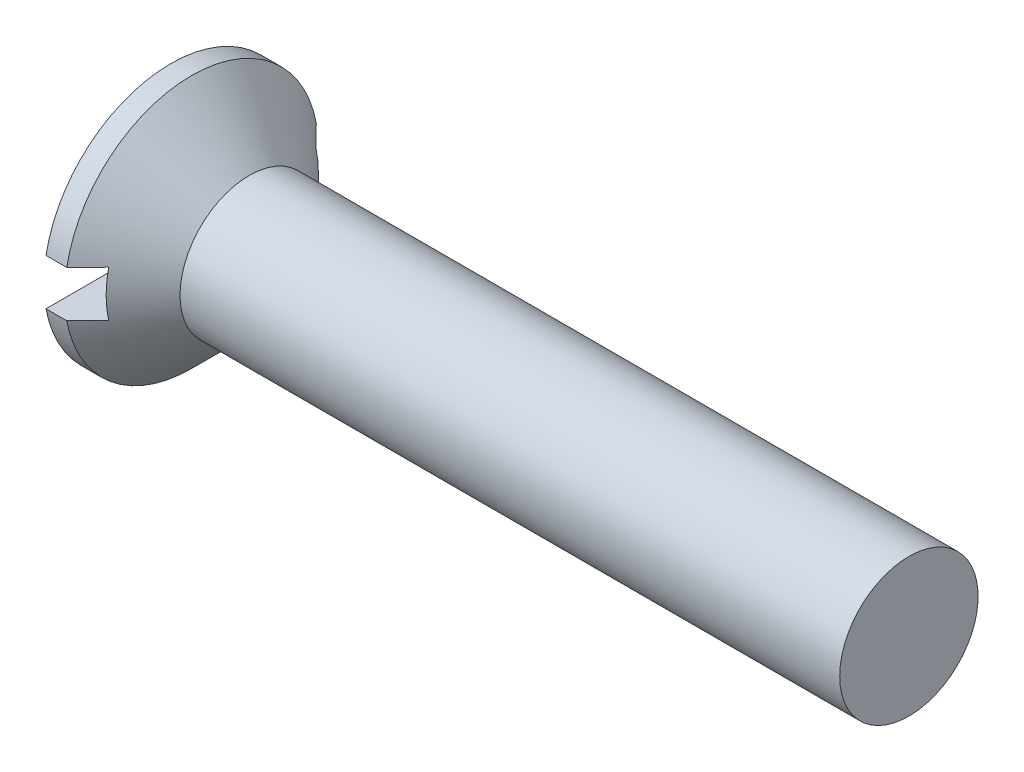
ISO-10303-21;
HEADER;
FILE_DESCRIPTION(('STEP AP214'),'2;1');
FILE_NAME('part.step','',(''),(''),'','','');
FILE_SCHEMA(('AUTOMOTIVE_DESIGN { 1 0 10303 214 1 1 1 1 }'));
ENDSEC;
DATA;
#1=APPLICATION_CONTEXT('core data for automotive mechanical design processes');
#2=APPLICATION_PROTOCOL_DEFINITION('international standard','automotive_design',2000,#1);
#3=PRODUCT_CONTEXT('',#1,'mechanical');
#4=PRODUCT('Part','Part','',(#3));
#5=PRODUCT_RELATED_PRODUCT_CATEGORY('part','',(#4));
#6=PRODUCT_DEFINITION_FORMATION('','',#4);
#7=PRODUCT_DEFINITION_CONTEXT('part definition',#1,'design');
#8=PRODUCT_DEFINITION('design','',#6,#7);
#9=PRODUCT_DEFINITION_SHAPE('','',#8);
#10=(LENGTH_UNIT() NAMED_UNIT(*) SI_UNIT(.MILLI.,.METRE.));
#11=(NAMED_UNIT(*) PLANE_ANGLE_UNIT() SI_UNIT($,.RADIAN.));
#12=(NAMED_UNIT(*) SI_UNIT($,.STERADIAN.) SOLID_ANGLE_UNIT());
#13=UNCERTAINTY_MEASURE_WITH_UNIT(LENGTH_MEASURE(1.E-05),#10,'distance_accuracy_value','');
#14=(GEOMETRIC_REPRESENTATION_CONTEXT(3) GLOBAL_UNCERTAINTY_ASSIGNED_CONTEXT((#13)) GLOBAL_UNIT_ASSIGNED_CONTEXT((#10,
#11,#12)) REPRESENTATION_CONTEXT('',''));
#15=CARTESIAN_POINT('',(0.,0.,0.));
#16=DIRECTION('',(0.,0.,1.));
#17=DIRECTION('',(1.,0.,0.));
#18=AXIS2_PLACEMENT_3D('',#15,#16,#17);
#19=CARTESIAN_POINT('',(0.,0.,0.));
#20=DIRECTION('',(-1.,0.,0.));
#21=DIRECTION('',(0.,0.,1.));
#22=AXIS2_PLACEMENT_3D('',#19,#20,#21);
#23=PLANE('',#22);
#24=DIRECTION('',(0.,0.,-1.));
#25=VECTOR('',#24,1.);
#26=CARTESIAN_POINT('',(0.,0.5,2.75));
#27=LINE('',#26,#25);
#28=CARTESIAN_POINT('',(0.,0.5,2.70416345659799));
#29=VERTEX_POINT('',#28);
#30=CARTESIAN_POINT('',(0.,0.5,-2.70416345659799));
#31=VERTEX_POINT('',#30);
#32=EDGE_CURVE('E162',#29,#31,#27,.T.);
#33=ORIENTED_EDGE('',*,*,#32,.F.);
#34=CARTESIAN_POINT('',(0.,0.,0.));
#35=DIRECTION('',(-1.,0.,0.));
#36=DIRECTION('',(0.,0.,1.));
#37=AXIS2_PLACEMENT_3D('',#34,#35,#36);
#38=CIRCLE('',#37,2.75);
#39=EDGE_CURVE('E113',#29,#31,#38,.T.);
#40=ORIENTED_EDGE('',*,*,#39,.T.);
#41=EDGE_LOOP('',(#33,#40));
#42=FACE_BOUND('',#41,.T.);
#43=ADVANCED_FACE('F32',(#42),#23,.T.);
#44=CARTESIAN_POINT('',(-6.34999999999999,0.,0.));
#45=DIRECTION('',(-1.,0.,0.));
#46=DIRECTION('',(0.,0.,1.));
#47=AXIS2_PLACEMENT_3D('',#44,#45,#46);
#48=CYLINDRICAL_SURFACE('',#47,2.75);
#49=DIRECTION('',(-1.,0.,0.));
#50=VECTOR('',#49,1.);
#51=CARTESIAN_POINT('',(-6.34999999999999,0.5,-2.70416345659799));
#52=LINE('',#51,#50);
#53=CARTESIAN_POINT('',(0.450000000000005,0.5,-2.70416345659799));
#54=VERTEX_POINT('',#53);
#55=EDGE_CURVE('E60',#31,#54,#52,.F.);
#56=ORIENTED_EDGE('',*,*,#55,.F.);
#57=ORIENTED_EDGE('',*,*,#39,.F.);
#58=DIRECTION('',(-1.,0.,0.));
#59=VECTOR('',#58,1.);
#60=CARTESIAN_POINT('',(-6.34999999999999,0.5,2.70416345659799));
#61=LINE('',#60,#59);
#62=CARTESIAN_POINT('',(0.450000000000005,0.5,2.70416345659799));
#63=VERTEX_POINT('',#62);
#64=EDGE_CURVE('E168',#63,#29,#61,.T.);
#65=ORIENTED_EDGE('',*,*,#64,.F.);
#66=CARTESIAN_POINT('',(0.450000000000005,0.,0.));
#67=DIRECTION('',(-1.,0.,0.));
#68=DIRECTION('',(0.,0.,1.));
#69=AXIS2_PLACEMENT_3D('',#66,#67,#68);
#70=CIRCLE('',#69,2.75);
#71=EDGE_CURVE('E107',#63,#54,#70,.T.);
#72=ORIENTED_EDGE('',*,*,#71,.T.);
#73=EDGE_LOOP('',(#56,#57,#65,#72));
#74=FACE_BOUND('',#73,.T.);
#75=ADVANCED_FACE('F147',(#74),#48,.T.);
#76=DIRECTION('',(0.,0.,1.));
#77=VECTOR('',#76,1.);
#78=CARTESIAN_POINT('',(0.,-0.5,-2.75));
#79=LINE('',#78,#77);
#80=CARTESIAN_POINT('',(0.,-0.5,-2.70416345659799));
#81=VERTEX_POINT('',#80);
#82=CARTESIAN_POINT('',(0.,-0.5,2.70416345659799));
#83=VERTEX_POINT('',#82);
#84=EDGE_CURVE('E101',#81,#83,#79,.T.);
#85=ORIENTED_EDGE('',*,*,#84,.F.);
#86=EDGE_CURVE('E109',#81,#83,#38,.T.);
#87=ORIENTED_EDGE('',*,*,#86,.T.);
#88=EDGE_LOOP('',(#85,#87));
#89=FACE_BOUND('',#88,.T.);
#90=ADVANCED_FACE('F34',(#89),#23,.T.);
#91=DIRECTION('',(-1.,0.,0.));
#92=VECTOR('',#91,1.);
#93=CARTESIAN_POINT('',(-6.34999999999999,-0.5,2.70416345659799));
#94=LINE('',#93,#92);
#95=CARTESIAN_POINT('',(0.450000000000005,-0.5,2.70416345659799));
#96=VERTEX_POINT('',#95);
#97=EDGE_CURVE('E167',#83,#96,#94,.F.);
#98=ORIENTED_EDGE('',*,*,#97,.F.);
#99=ORIENTED_EDGE('',*,*,#86,.F.);
#100=DIRECTION('',(-1.,0.,0.));
#101=VECTOR('',#100,1.);
#102=CARTESIAN_POINT('',(-6.34999999999999,-0.5,-2.70416345659799));
#103=LINE('',#102,#101);
#104=CARTESIAN_POINT('',(0.450000000000005,-0.5,-2.70416345659799));
#105=VERTEX_POINT('',#104);
#106=EDGE_CURVE('E165',#105,#81,#103,.T.);
#107=ORIENTED_EDGE('',*,*,#106,.F.);
#108=EDGE_CURVE('E110',#105,#96,#70,.T.);
#109=ORIENTED_EDGE('',*,*,#108,.T.);
#110=EDGE_LOOP('',(#98,#99,#107,#109));
#111=FACE_BOUND('',#110,.T.);
#112=ADVANCED_FACE('F143',(#111),#48,.T.);
#113=CARTESIAN_POINT('',(0.450000000000005,0.,0.));
#114=DIRECTION('',(-1.,0.,0.));
#115=DIRECTION('',(0.,0.,1.));
#116=AXIS2_PLACEMENT_3D('',#113,#114,#115);
#117=CONICAL_SURFACE('',#116,2.75,0.78539816339745);
#118=CARTESIAN_POINT('',(-2.86122703099808,0.499999999999999,-6.04056894019943));
#119=CARTESIAN_POINT('',(-2.64645314908392,0.499999999999999,-5.82505395090795));
#120=CARTESIAN_POINT('',(-2.43171226512779,0.499999999999999,-5.60950603698235));
#121=CARTESIAN_POINT('',(-2.00233044660302,0.499999999999999,-5.17828713323768));
#122=CARTESIAN_POINT('',(-1.78768951816523,0.499999999999999,-4.96261613731429));
#123=CARTESIAN_POINT('',(-1.35843850720867,0.499999999999999,-4.53099014667525));
#124=CARTESIAN_POINT('',(-1.14382851766506,0.5,-4.31503505946921));
#125=CARTESIAN_POINT('',(-0.714865259334248,0.5,-3.88289290459598));
#126=CARTESIAN_POINT('',(-0.500511977458418,0.5,-3.66670584992331));
#127=CARTESIAN_POINT('',(-0.084147384025923,0.5,-3.24599747567559));
#128=CARTESIAN_POINT('',(0.117885730369075,0.5,-3.04149775579801));
#129=CARTESIAN_POINT('',(0.420463906876821,0.5,-2.73425122241966));
#130=CARTESIAN_POINT('',(0.521252800272222,0.5,-2.63174462492795));
#131=CARTESIAN_POINT('',(0.722596709201723,0.5,-2.42650486288046));
#132=CARTESIAN_POINT('',(0.823151728136315,0.5,-2.32377170166173));
#133=CARTESIAN_POINT('',(1.02391348542914,0.5,-2.11798641521137));
#134=CARTESIAN_POINT('',(1.12412025955289,0.5,-2.0149343249209));
#135=CARTESIAN_POINT('',(1.32401405460918,0.5,-1.80831591529526));
#136=CARTESIAN_POINT('',(1.42370104595628,0.5,-1.70474956733023));
#137=CARTESIAN_POINT('',(1.62218746371898,0.5,-1.49682252686534));
#138=CARTESIAN_POINT('',(1.72098713892808,0.5,-1.39246207321225));
#139=CARTESIAN_POINT('',(1.86795734842052,0.5,-1.23478310137792));
#140=CARTESIAN_POINT('',(1.91674032983076,0.5,-1.18203616899574));
#141=CARTESIAN_POINT('',(2.01370537395731,0.5,-1.07599359649629));
#142=CARTESIAN_POINT('',(2.06188745654593,0.5,-1.02269797463168));
#143=CARTESIAN_POINT('',(2.13636633861871,0.5,-0.938884874208381));
#144=CARTESIAN_POINT('',(2.1629779188587,0.5,-0.908647396413155));
#145=CARTESIAN_POINT('',(2.21582247374852,0.5,-0.847839966000395));
#146=CARTESIAN_POINT('',(2.24205542948803,0.5,-0.817269996909455));
#147=CARTESIAN_POINT('',(2.29399092697755,0.5,-0.755728155035226));
#148=CARTESIAN_POINT('',(2.31969392132551,0.5,-0.724756665395605));
#149=CARTESIAN_POINT('',(2.37039971782112,0.5,-0.662247214771428));
#150=CARTESIAN_POINT('',(2.39540257817305,0.5,-0.630709301235348));
#151=CARTESIAN_POINT('',(2.44478892372954,0.5,-0.566371603754688));
#152=CARTESIAN_POINT('',(2.46915694943251,0.5,-0.533559868327224));
#153=CARTESIAN_POINT('',(2.5163889987046,0.5,-0.466780210084488));
#154=CARTESIAN_POINT('',(2.53925066793349,0.5,-0.432810597670798));
#155=CARTESIAN_POINT('',(2.58232697878151,0.5,-0.363658935512935));
#156=CARTESIAN_POINT('',(2.60256495908195,0.5,-0.328491684655966));
#157=CARTESIAN_POINT('',(2.63905280590059,0.5,-0.256187217130638));
#158=CARTESIAN_POINT('',(2.65531541020278,0.5,-0.219056768706155));
#159=CARTESIAN_POINT('',(2.67831565254528,0.5,-0.151370362439321));
#160=CARTESIAN_POINT('',(2.68638760428836,0.5,-0.121286771234599));
#161=CARTESIAN_POINT('',(2.69727224091005,0.5,-0.0602273336601249));
#162=CARTESIAN_POINT('',(2.70010276113889,0.5,-0.0292548786647114));
#163=CARTESIAN_POINT('',(2.69989106797124,0.5,0.0327694360363164));
#164=CARTESIAN_POINT('',(2.69682969111656,0.5,0.063821225682388));
#165=CARTESIAN_POINT('',(2.68549977753905,0.5,0.12499977678534));
#166=CARTESIAN_POINT('',(2.67721442014879,0.5,0.155123219174709));
#167=CARTESIAN_POINT('',(2.65581950691551,0.5,0.21693192651913));
#168=CARTESIAN_POINT('',(2.64231107910801,0.5,0.248473115662978));
#169=CARTESIAN_POINT('',(2.61226111563965,0.5,0.310100842939138));
#170=CARTESIAN_POINT('',(2.5957135686819,0.5,0.34018434607434));
#171=CARTESIAN_POINT('',(2.5605041795527,0.5,0.399406290947289));
#172=CARTESIAN_POINT('',(2.54182586526724,0.5,0.428534766371342));
#173=CARTESIAN_POINT('',(2.50314736749682,0.5,0.485848931912499));
#174=CARTESIAN_POINT('',(2.48314845190395,0.5,0.514035488287138));
#175=CARTESIAN_POINT('',(2.44021488006025,0.5,0.572453957706265));
#176=CARTESIAN_POINT('',(2.41718470835065,0.5,0.602615197043547));
#177=CARTESIAN_POINT('',(2.37034084753578,0.5,0.662325051628798));
#178=CARTESIAN_POINT('',(2.34652705850378,0.5,0.691873587955689));
#179=CARTESIAN_POINT('',(2.27423059701714,0.5,0.779858563131309));
#180=CARTESIAN_POINT('',(2.22491346686215,0.5,0.837607215750436));
#181=CARTESIAN_POINT('',(2.1249495519481,0.5,0.952102703441985));
#182=CARTESIAN_POINT('',(2.07430063465108,0.5,1.00884765340576));
#183=CARTESIAN_POINT('',(1.9722266811487,0.5,1.12160621283997));
#184=CARTESIAN_POINT('',(1.92080185796101,0.5,1.17762001543789));
#185=CARTESIAN_POINT('',(1.81763954802254,0.5,1.28893510731713));
#186=CARTESIAN_POINT('',(1.76590418022471,0.5,1.34423836675372));
#187=CARTESIAN_POINT('',(1.66206542848175,0.5,1.45450503817801));
#188=CARTESIAN_POINT('',(1.60996201969631,0.5,1.50946842674798));
#189=CARTESIAN_POINT('',(1.45336624557892,0.5,1.6738734546545));
#190=CARTESIAN_POINT('',(1.34848313725796,0.5,1.78294252528654));
#191=CARTESIAN_POINT('',(1.07434617350676,0.5,2.06649579664628));
#192=CARTESIAN_POINT('',(0.904632097546293,0.5,2.24053384961835));
#193=CARTESIAN_POINT('',(0.564471516688197,0.5,2.58789645095191));
#194=CARTESIAN_POINT('',(0.394025000017388,0.5,2.76122098775606));
#195=CARTESIAN_POINT('',(0.0526319560366418,0.5,3.10753470651554));
#196=CARTESIAN_POINT('',(-0.118314765907586,0.5,3.28052369652716));
#197=CARTESIAN_POINT('',(-0.460468290964594,0.5,3.62624204114173));
#198=CARTESIAN_POINT('',(-0.631675092493465,0.5,3.79897139731323));
#199=CARTESIAN_POINT('',(-1.14563120847197,0.5,4.31699044613266));
#200=CARTESIAN_POINT('',(-1.48863434773124,0.5,4.66202826108349));
#201=CARTESIAN_POINT('',(-2.00330287402651,0.500000000000001,5.17925007279732));
#202=CARTESIAN_POINT('',(-2.1748433969761,0.500000000000001,5.3515584397005));
#203=CARTESIAN_POINT('',(-2.51799012245153,0.500000000000001,5.69610898332281));
#204=CARTESIAN_POINT('',(-2.68959632482711,0.500000000000001,5.86835116019158));
#205=CARTESIAN_POINT('',(-2.86122703099808,0.500000000000001,6.04056894019943));
#206=B_SPLINE_CURVE_WITH_KNOTS('',3,(#118,#119,#120,#121,#122,#123,#124,#125,#126,#127,#128,
#129,#130,#131,#132,#133,#134,#135,#136,#137,#138,#139,#140,#141,#142,#143,#144,#145,#146,#147,
#148,#149,#150,#151,#152,#153,#154,#155,#156,#157,#158,#159,#160,#161,#162,#163,#164,#165,#166,
#167,#168,#169,#170,#171,#172,#173,#174,#175,#176,#177,#178,#179,#180,#181,#182,#183,#184,#185,
#186,#187,#188,#189,#190,#191,#192,#193,#194,#195,#196,#197,#198,#199,#200,#201,#202,#203,#204,
#205),.UNSPECIFIED.,.F.,.F.,(4,2,2,2,2,2,2,2,2,2,2,2,2,2,2,2,2,2,2,2,2,2,2,2,2,2,2,2,2,2,2,2,2,
2,2,2,2,2,2,2,2,2,2,4),(0.,0.912781927776979,1.82561394078363,2.7389847160849,3.6523067498125,
4.51470802948282,4.94597801687646,5.37724169398376,5.8084596866698,6.23970196156881,
6.67081928880482,6.88635822410756,7.10189001232592,7.22272783582019,7.34357167379229,
7.46430763377504,7.58503352663001,7.70761785492102,7.83038944010351,7.95198051911907,
8.07317673679879,8.16626522690189,8.25903637269142,8.3521097676187,8.44548439032231,
8.5481760171626,8.65107299674598,8.75482756994762,8.858483938704,8.9723109830159,
9.08615259921398,9.31393806424693,9.54211363831153,9.77022766936078,9.99741497255038,
10.2246177587246,10.6785611422331,11.4078226253695,12.1370958747598,12.866706070028,
13.5963118395739,15.0558728600348,15.7852883305285,16.5147021422058),.UNSPECIFIED.);
#207=CARTESIAN_POINT('',(0.9,0.5,2.24499443206437));
#208=VERTEX_POINT('',#207);
#209=EDGE_CURVE('E11',#208,#63,#206,.T.);
#210=ORIENTED_EDGE('',*,*,#209,.F.);
#211=CARTESIAN_POINT('',(0.9,0.,0.));
#212=DIRECTION('',(1.,0.,0.));
#213=DIRECTION('',(0.,0.,-1.));
#214=AXIS2_PLACEMENT_3D('',#211,#212,#213);
#215=CIRCLE('',#214,2.3);
#216=CARTESIAN_POINT('',(0.9,-0.5,2.24499443206437));
#217=VERTEX_POINT('',#216);
#218=EDGE_CURVE('E89',#217,#208,#215,.F.);
#219=ORIENTED_EDGE('',*,*,#218,.F.);
#220=CARTESIAN_POINT('',(-2.86122703099809,-0.5,6.04056894019943));
#221=CARTESIAN_POINT('',(-2.64645314908392,-0.5,5.82505395090795));
#222=CARTESIAN_POINT('',(-2.43171226512779,-0.5,5.60950603698235));
#223=CARTESIAN_POINT('',(-2.00233044660302,-0.5,5.17828713323768));
#224=CARTESIAN_POINT('',(-1.78768951816524,-0.5,4.96261613731429));
#225=CARTESIAN_POINT('',(-1.35843850720867,-0.5,4.53099014667525));
#226=CARTESIAN_POINT('',(-1.14382851766507,-0.5,4.31503505946921));
#227=CARTESIAN_POINT('',(-0.714865259334247,-0.5,3.88289290459598));
#228=CARTESIAN_POINT('',(-0.500511977458417,-0.5,3.66670584992331));
#229=CARTESIAN_POINT('',(-0.0841473840259209,-0.5,3.24599747567559));
#230=CARTESIAN_POINT('',(0.117885730369076,-0.5,3.041497755798));
#231=CARTESIAN_POINT('',(0.420463906876822,-0.5,2.73425122241966));
#232=CARTESIAN_POINT('',(0.521252800272224,-0.5,2.63174462492795));
#233=CARTESIAN_POINT('',(0.722596709201724,-0.5,2.42650486288046));
#234=CARTESIAN_POINT('',(0.823151728136316,-0.5,2.32377170166173));
#235=CARTESIAN_POINT('',(1.02391348542914,-0.5,2.11798641521136));
#236=CARTESIAN_POINT('',(1.12412025955289,-0.5,2.0149343249209));
#237=CARTESIAN_POINT('',(1.32401405460918,-0.5,1.80831591529526));
#238=CARTESIAN_POINT('',(1.42370104595628,-0.5,1.70474956733023));
#239=CARTESIAN_POINT('',(1.62218746371898,-0.5,1.49682252686534));
#240=CARTESIAN_POINT('',(1.72098713892808,-0.5,1.39246207321225));
#241=CARTESIAN_POINT('',(1.86795734842052,-0.5,1.23478310137792));
#242=CARTESIAN_POINT('',(1.91674032983076,-0.5,1.18203616899574));
#243=CARTESIAN_POINT('',(2.01370537395731,-0.5,1.07599359649629));
#244=CARTESIAN_POINT('',(2.06188745654593,-0.5,1.02269797463169));
#245=CARTESIAN_POINT('',(2.13636633861871,-0.5,0.938884874208381));
#246=CARTESIAN_POINT('',(2.1629779188587,-0.5,0.908647396413155));
#247=CARTESIAN_POINT('',(2.21582247374852,-0.5,0.847839966000396));
#248=CARTESIAN_POINT('',(2.24205542948803,-0.5,0.817269996909455));
#249=CARTESIAN_POINT('',(2.29399092697755,-0.5,0.755728155035227));
#250=CARTESIAN_POINT('',(2.31969392132551,-0.5,0.724756665395605));
#251=CARTESIAN_POINT('',(2.37039971782112,-0.5,0.662247214771428));
#252=CARTESIAN_POINT('',(2.39540257817305,-0.5,0.630709301235348));
#253=CARTESIAN_POINT('',(2.44478892372954,-0.5,0.566371603754689));
#254=CARTESIAN_POINT('',(2.46915694943251,-0.5,0.533559868327225));
#255=CARTESIAN_POINT('',(2.5163889987046,-0.5,0.466780210084489));
#256=CARTESIAN_POINT('',(2.53925066793348,-0.5,0.432810597670799));
#257=CARTESIAN_POINT('',(2.5823269787815,-0.5,0.363658935512936));
#258=CARTESIAN_POINT('',(2.60256495908195,-0.5,0.328491684655968));
#259=CARTESIAN_POINT('',(2.63905280590059,-0.5,0.256187217130639));
#260=CARTESIAN_POINT('',(2.65531541020278,-0.5,0.219056768706156));
#261=CARTESIAN_POINT('',(2.67831565254528,-0.5,0.151370362439322));
#262=CARTESIAN_POINT('',(2.68638760428836,-0.5,0.1212867712346));
#263=CARTESIAN_POINT('',(2.69727224091005,-0.5,0.0602273336601255));
#264=CARTESIAN_POINT('',(2.70010276113889,-0.5,0.029254878664712));
#265=CARTESIAN_POINT('',(2.69989106797124,-0.5,-0.0327694360363154));
#266=CARTESIAN_POINT('',(2.69682969111656,-0.5,-0.0638212256823867));
#267=CARTESIAN_POINT('',(2.68549977753905,-0.5,-0.124999776785339));
#268=CARTESIAN_POINT('',(2.67721442014879,-0.5,-0.155123219174708));
#269=CARTESIAN_POINT('',(2.65581950691551,-0.5,-0.216931926519129));
#270=CARTESIAN_POINT('',(2.64231107910801,-0.5,-0.248473115662977));
#271=CARTESIAN_POINT('',(2.61226111563965,-0.5,-0.310100842939135));
#272=CARTESIAN_POINT('',(2.59571356868191,-0.5,-0.340184346074338));
#273=CARTESIAN_POINT('',(2.5605041795527,-0.5,-0.399406290947286));
#274=CARTESIAN_POINT('',(2.54182586526724,-0.5,-0.42853476637134));
#275=CARTESIAN_POINT('',(2.50314736749682,-0.5,-0.485848931912496));
#276=CARTESIAN_POINT('',(2.48314845190395,-0.5,-0.514035488287135));
#277=CARTESIAN_POINT('',(2.44021488006025,-0.5,-0.572453957706262));
#278=CARTESIAN_POINT('',(2.41718470835065,-0.5,-0.602615197043544));
#279=CARTESIAN_POINT('',(2.37034084753579,-0.5,-0.662325051628795));
#280=CARTESIAN_POINT('',(2.34652705850379,-0.5,-0.691873587955685));
#281=CARTESIAN_POINT('',(2.27423059701715,-0.5,-0.779858563131305));
#282=CARTESIAN_POINT('',(2.22491346686215,-0.5,-0.83760721575043));
#283=CARTESIAN_POINT('',(2.1249495519481,-0.5,-0.952102703441979));
#284=CARTESIAN_POINT('',(2.07430063465109,-0.5,-1.00884765340575));
#285=CARTESIAN_POINT('',(1.97222668114871,-0.5,-1.12160621283996));
#286=CARTESIAN_POINT('',(1.92080185796102,-0.5,-1.17762001543789));
#287=CARTESIAN_POINT('',(1.81763954802255,-0.5,-1.28893510731712));
#288=CARTESIAN_POINT('',(1.76590418022472,-0.5,-1.34423836675372));
#289=CARTESIAN_POINT('',(1.66206542848175,-0.5,-1.454505038178));
#290=CARTESIAN_POINT('',(1.60996201969632,-0.5,-1.50946842674797));
#291=CARTESIAN_POINT('',(1.45336624557893,-0.5,-1.67387345465449));
#292=CARTESIAN_POINT('',(1.34848313725797,-0.5,-1.78294252528653));
#293=CARTESIAN_POINT('',(1.07434617350677,-0.5,-2.06649579664627));
#294=CARTESIAN_POINT('',(0.904632097546303,-0.5,-2.24053384961834));
#295=CARTESIAN_POINT('',(0.564471516688207,-0.5,-2.5878964509519));
#296=CARTESIAN_POINT('',(0.394025000017397,-0.5,-2.76122098775605));
#297=CARTESIAN_POINT('',(0.0526319560366509,-0.5,-3.10753470651553));
#298=CARTESIAN_POINT('',(-0.118314765907578,-0.5,-3.28052369652715));
#299=CARTESIAN_POINT('',(-0.460468290964587,-0.5,-3.62624204114172));
#300=CARTESIAN_POINT('',(-0.631675092493458,-0.5,-3.79897139731322));
#301=CARTESIAN_POINT('',(-1.14563120847196,-0.5,-4.31699044613266));
#302=CARTESIAN_POINT('',(-1.48863434773124,-0.5,-4.66202826108349));
#303=CARTESIAN_POINT('',(-2.0033028740265,-0.5,-5.17925007279732));
#304=CARTESIAN_POINT('',(-2.1748433969761,-0.5,-5.3515584397005));
#305=CARTESIAN_POINT('',(-2.51799012245153,-0.5,-5.69610898332281));
#306=CARTESIAN_POINT('',(-2.68959632482711,-0.5,-5.86835116019158));
#307=CARTESIAN_POINT('',(-2.86122703099808,-0.5,-6.04056894019943));
#308=B_SPLINE_CURVE_WITH_KNOTS('',3,(#220,#221,#222,#223,#224,#225,#226,#227,#228,#229,#230,
#231,#232,#233,#234,#235,#236,#237,#238,#239,#240,#241,#242,#243,#244,#245,#246,#247,#248,#249,
#250,#251,#252,#253,#254,#255,#256,#257,#258,#259,#260,#261,#262,#263,#264,#265,#266,#267,#268,
#269,#270,#271,#272,#273,#274,#275,#276,#277,#278,#279,#280,#281,#282,#283,#284,#285,#286,#287,
#288,#289,#290,#291,#292,#293,#294,#295,#296,#297,#298,#299,#300,#301,#302,#303,#304,#305,#306,
#307),.UNSPECIFIED.,.F.,.F.,(4,2,2,2,2,2,2,2,2,2,2,2,2,2,2,2,2,2,2,2,2,2,2,2,2,2,2,2,2,2,2,2,2,
2,2,2,2,2,2,2,2,2,2,4),(0.,0.912781927776981,1.82561394078363,2.7389847160849,3.65230674981251,
4.51470802948282,4.94597801687646,5.37724169398377,5.8084596866698,6.23970196156882,
6.67081928880483,6.88635822410756,7.10189001232592,7.2227278358202,7.34357167379229,
7.46430763377505,7.58503352663001,7.70761785492103,7.83038944010351,7.95198051911907,
8.07317673679879,8.16626522690189,8.25903637269142,8.3521097676187,8.44548439032231,
8.5481760171626,8.65107299674597,8.75482756994762,8.85848393870399,8.9723109830159,
9.08615259921397,9.31393806424692,9.54211363831152,9.77022766936077,9.99741497255036,
10.2246177587245,10.6785611422331,11.4078226253695,12.1370958747598,12.866706070028,
13.5963118395739,15.0558728600348,15.7852883305285,16.5147021422058),.UNSPECIFIED.);
#309=EDGE_CURVE('E46',#96,#217,#308,.T.);
#310=ORIENTED_EDGE('',*,*,#309,.F.);
#311=ORIENTED_EDGE('',*,*,#108,.F.);
#312=CARTESIAN_POINT('',(0.9,-0.5,-2.24499443206437));
#313=VERTEX_POINT('',#312);
#314=EDGE_CURVE('E119',#313,#105,#308,.T.);
#315=ORIENTED_EDGE('',*,*,#314,.F.);
#316=CARTESIAN_POINT('',(0.9,0.5,-2.24499443206437));
#317=VERTEX_POINT('',#316);
#318=EDGE_CURVE('E97',#317,#313,#215,.F.);
#319=ORIENTED_EDGE('',*,*,#318,.F.);
#320=EDGE_CURVE('E36',#54,#317,#206,.T.);
#321=ORIENTED_EDGE('',*,*,#320,.F.);
#322=ORIENTED_EDGE('',*,*,#71,.F.);
#323=EDGE_LOOP('',(#210,#219,#310,#311,#315,#319,#321,#322));
#324=FACE_BOUND('',#323,.T.);
#325=CARTESIAN_POINT('',(1.7,0.,0.));
#326=DIRECTION('',(-1.,0.,0.));
#327=DIRECTION('',(0.,0.,1.));
#328=AXIS2_PLACEMENT_3D('',#325,#326,#327);
#329=CIRCLE('',#328,1.5);
#330=CARTESIAN_POINT('',(1.7,0.,1.5));
#331=VERTEX_POINT('',#330);
#332=EDGE_CURVE('E116',#331,#331,#329,.T.);
#333=ORIENTED_EDGE('',*,*,#332,.T.);
#334=EDGE_LOOP('',(#333));
#335=FACE_BOUND('',#334,.T.);
#336=ADVANCED_FACE('F104',(#324,#335),#117,.T.);
#337=CARTESIAN_POINT('',(-6.34999999999999,0.,0.));
#338=DIRECTION('',(-1.,0.,0.));
#339=DIRECTION('',(0.,0.,1.));
#340=AXIS2_PLACEMENT_3D('',#337,#338,#339);
#341=CYLINDRICAL_SURFACE('',#340,1.5);
#342=CARTESIAN_POINT('',(16.,0.,0.));
#343=DIRECTION('',(-1.,0.,0.));
#344=DIRECTION('',(0.,0.,1.));
#345=AXIS2_PLACEMENT_3D('',#342,#343,#344);
#346=CIRCLE('',#345,1.5);
#347=CARTESIAN_POINT('',(16.,0.,1.5));
#348=VERTEX_POINT('',#347);
#349=EDGE_CURVE('E173',#348,#348,#346,.T.);
#350=ORIENTED_EDGE('',*,*,#349,.T.);
#351=EDGE_LOOP('',(#350));
#352=FACE_BOUND('',#351,.T.);
#353=ORIENTED_EDGE('',*,*,#332,.F.);
#354=EDGE_LOOP('',(#353));
#355=FACE_BOUND('',#354,.T.);
#356=ADVANCED_FACE('F136',(#352,#355),#341,.T.);
#357=CARTESIAN_POINT('',(16.,1.5,0.));
#358=DIRECTION('',(1.,0.,0.));
#359=DIRECTION('',(0.,0.,-1.));
#360=AXIS2_PLACEMENT_3D('',#357,#358,#359);
#361=PLANE('',#360);
#362=ORIENTED_EDGE('',*,*,#349,.F.);
#363=EDGE_LOOP('',(#362));
#364=FACE_BOUND('',#363,.T.);
#365=ADVANCED_FACE('F134',(#364),#361,.T.);
#366=CARTESIAN_POINT('',(0.9,0.5,2.75));
#367=DIRECTION('',(0.,1.,0.));
#368=DIRECTION('',(0.,0.,1.));
#369=AXIS2_PLACEMENT_3D('',#366,#367,#368);
#370=PLANE('',#369);
#371=ORIENTED_EDGE('',*,*,#55,.T.);
#372=ORIENTED_EDGE('',*,*,#320,.T.);
#373=DIRECTION('',(0.,0.,-1.));
#374=VECTOR('',#373,1.);
#375=CARTESIAN_POINT('',(0.9,0.5,2.75));
#376=LINE('',#375,#374);
#377=EDGE_CURVE('E53',#208,#317,#376,.T.);
#378=ORIENTED_EDGE('',*,*,#377,.F.);
#379=ORIENTED_EDGE('',*,*,#209,.T.);
#380=ORIENTED_EDGE('',*,*,#64,.T.);
#381=ORIENTED_EDGE('',*,*,#32,.T.);
#382=EDGE_LOOP('',(#371,#372,#378,#379,#380,#381));
#383=FACE_BOUND('',#382,.T.);
#384=ADVANCED_FACE('F98',(#383),#370,.F.);
#385=CARTESIAN_POINT('',(0.9,-0.5,-2.75));
#386=DIRECTION('',(0.,-1.,0.));
#387=DIRECTION('',(0.,0.,-1.));
#388=AXIS2_PLACEMENT_3D('',#385,#386,#387);
#389=PLANE('',#388);
#390=ORIENTED_EDGE('',*,*,#97,.T.);
#391=ORIENTED_EDGE('',*,*,#309,.T.);
#392=DIRECTION('',(0.,0.,1.));
#393=VECTOR('',#392,1.);
#394=CARTESIAN_POINT('',(0.9,-0.5,-2.75));
#395=LINE('',#394,#393);
#396=EDGE_CURVE('E92',#313,#217,#395,.T.);
#397=ORIENTED_EDGE('',*,*,#396,.F.);
#398=ORIENTED_EDGE('',*,*,#314,.T.);
#399=ORIENTED_EDGE('',*,*,#106,.T.);
#400=ORIENTED_EDGE('',*,*,#84,.T.);
#401=EDGE_LOOP('',(#390,#391,#397,#398,#399,#400));
#402=FACE_BOUND('',#401,.T.);
#403=ADVANCED_FACE('F126',(#402),#389,.F.);
#404=CARTESIAN_POINT('',(0.9,-0.5,-2.75));
#405=DIRECTION('',(1.,0.,0.));
#406=DIRECTION('',(0.,0.,-1.));
#407=AXIS2_PLACEMENT_3D('',#404,#405,#406);
#408=PLANE('',#407);
#409=ORIENTED_EDGE('',*,*,#218,.T.);
#410=ORIENTED_EDGE('',*,*,#377,.T.);
#411=ORIENTED_EDGE('',*,*,#318,.T.);
#412=ORIENTED_EDGE('',*,*,#396,.T.);
#413=EDGE_LOOP('',(#409,#410,#411,#412));
#414=FACE_BOUND('',#413,.T.);
#415=ADVANCED_FACE('F90',(#414),#408,.F.);
#416=CLOSED_SHELL('',(#43,#75,#90,#112,#336,#356,#365,#384,#403,#415));
#417=MANIFOLD_SOLID_BREP('B2',#416);
#418=ADVANCED_BREP_SHAPE_REPRESENTATION('',(#18,#417),#14);
#419=SHAPE_DEFINITION_REPRESENTATION(#9,#418);
ENDSEC;
END-ISO-10303-21;
